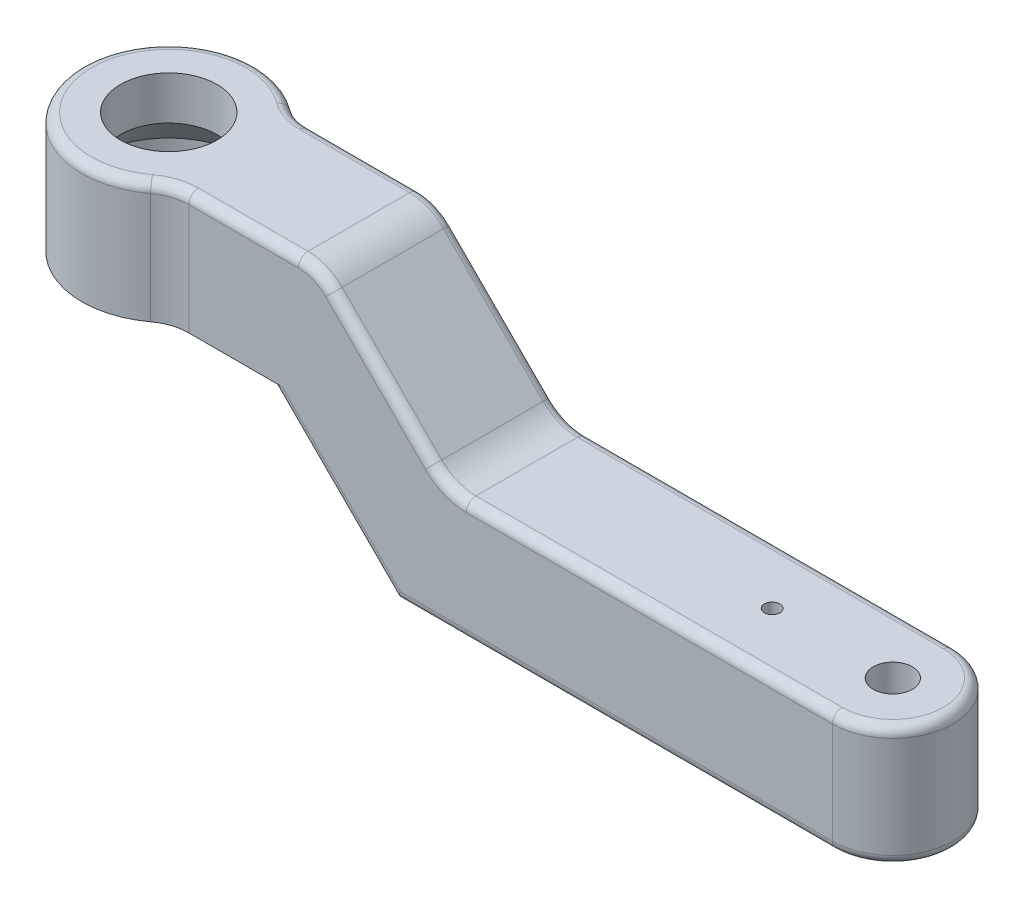
ISO-10303-21;
HEADER;
FILE_DESCRIPTION(('STEP AP214'),'2;1');
FILE_NAME('part.step','',(''),(''),'','','');
FILE_SCHEMA(('AUTOMOTIVE_DESIGN { 1 0 10303 214 1 1 1 1 }'));
ENDSEC;
DATA;
#1=APPLICATION_CONTEXT('core data for automotive mechanical design processes');
#2=APPLICATION_PROTOCOL_DEFINITION('international standard','automotive_design',2000,#1);
#3=PRODUCT_CONTEXT('',#1,'mechanical');
#4=PRODUCT('Part','Part','',(#3));
#5=PRODUCT_RELATED_PRODUCT_CATEGORY('part','',(#4));
#6=PRODUCT_DEFINITION_FORMATION('','',#4);
#7=PRODUCT_DEFINITION_CONTEXT('part definition',#1,'design');
#8=PRODUCT_DEFINITION('design','',#6,#7);
#9=PRODUCT_DEFINITION_SHAPE('','',#8);
#10=(LENGTH_UNIT() NAMED_UNIT(*) SI_UNIT(.MILLI.,.METRE.));
#11=(NAMED_UNIT(*) PLANE_ANGLE_UNIT() SI_UNIT($,.RADIAN.));
#12=(NAMED_UNIT(*) SI_UNIT($,.STERADIAN.) SOLID_ANGLE_UNIT());
#13=UNCERTAINTY_MEASURE_WITH_UNIT(LENGTH_MEASURE(1.E-05),#10,'distance_accuracy_value','');
#14=(GEOMETRIC_REPRESENTATION_CONTEXT(3) GLOBAL_UNCERTAINTY_ASSIGNED_CONTEXT((#13)) GLOBAL_UNIT_ASSIGNED_CONTEXT((#10,
#11,#12)) REPRESENTATION_CONTEXT('',''));
#15=CARTESIAN_POINT('',(0.,0.,0.));
#16=DIRECTION('',(0.,0.,1.));
#17=DIRECTION('',(1.,0.,0.));
#18=AXIS2_PLACEMENT_3D('',#15,#16,#17);
#19=CARTESIAN_POINT('',(75.,51.5,0.));
#20=DIRECTION('',(0.,-1.,0.));
#21=DIRECTION('',(0.,0.,-1.));
#22=AXIS2_PLACEMENT_3D('',#19,#20,#21);
#23=CYLINDRICAL_SURFACE('',#22,12.5);
#24=DIRECTION('',(0.,-1.,0.));
#25=VECTOR('',#24,1.);
#26=CARTESIAN_POINT('',(75.,51.5,12.5));
#27=LINE('',#26,#25);
#28=CARTESIAN_POINT('',(75.,23.,12.5));
#29=VERTEX_POINT('',#28);
#30=CARTESIAN_POINT('',(75.,2.,12.5));
#31=VERTEX_POINT('',#30);
#32=EDGE_CURVE('E197',#29,#31,#27,.T.);
#33=ORIENTED_EDGE('',*,*,#32,.T.);
#34=CARTESIAN_POINT('',(75.,2.,0.));
#35=DIRECTION('',(0.,1.,0.));
#36=DIRECTION('',(0.,0.,1.));
#37=AXIS2_PLACEMENT_3D('',#34,#35,#36);
#38=CIRCLE('',#37,12.5);
#39=CARTESIAN_POINT('',(75.,2.,-12.5));
#40=VERTEX_POINT('',#39);
#41=EDGE_CURVE('E363',#31,#40,#38,.T.);
#42=ORIENTED_EDGE('',*,*,#41,.T.);
#43=DIRECTION('',(0.,-1.,0.));
#44=VECTOR('',#43,1.);
#45=CARTESIAN_POINT('',(75.,51.5,-12.5));
#46=LINE('',#45,#44);
#47=CARTESIAN_POINT('',(75.,23.,-12.5));
#48=VERTEX_POINT('',#47);
#49=EDGE_CURVE('E231',#48,#40,#46,.T.);
#50=ORIENTED_EDGE('',*,*,#49,.F.);
#51=CARTESIAN_POINT('',(75.,23.,0.));
#52=DIRECTION('',(0.,-1.,0.));
#53=DIRECTION('',(1.,0.,0.));
#54=AXIS2_PLACEMENT_3D('',#51,#52,#53);
#55=CIRCLE('',#54,12.5);
#56=EDGE_CURVE('E310',#48,#29,#55,.T.);
#57=ORIENTED_EDGE('',*,*,#56,.T.);
#58=EDGE_LOOP('',(#33,#42,#50,#57));
#59=FACE_BOUND('',#58,.T.);
#60=ADVANCED_FACE('F35',(#59),#23,.T.);
#61=CARTESIAN_POINT('',(75.,51.5,-12.5));
#62=DIRECTION('',(0.,0.,1.));
#63=DIRECTION('',(1.,0.,0.));
#64=AXIS2_PLACEMENT_3D('',#61,#62,#63);
#65=PLANE('',#64);
#66=DIRECTION('',(-0.707106781186547,0.707106781186548,0.));
#67=VECTOR('',#66,1.);
#68=CARTESIAN_POINT('',(5.48654403270937,-18.0134559672906,-12.5));
#69=LINE('',#68,#67);
#70=CARTESIAN_POINT('',(-14.5269119345812,2.,-12.5));
#71=VERTEX_POINT('',#70);
#72=CARTESIAN_POINT('',(-39.0269119345812,26.5,-12.5));
#73=VERTEX_POINT('',#72);
#74=EDGE_CURVE('E370',#71,#73,#69,.T.);
#75=ORIENTED_EDGE('',*,*,#74,.T.);
#76=DIRECTION('',(-1.,0.,0.));
#77=VECTOR('',#76,1.);
#78=CARTESIAN_POINT('',(75.,26.5,-12.5));
#79=LINE('',#78,#77);
#80=CARTESIAN_POINT('',(-58.334166687501,26.5,-12.5));
#81=VERTEX_POINT('',#80);
#82=EDGE_CURVE('E51',#73,#81,#79,.T.);
#83=ORIENTED_EDGE('',*,*,#82,.T.);
#84=DIRECTION('',(0.,-1.,0.));
#85=VECTOR('',#84,1.);
#86=CARTESIAN_POINT('',(-58.334166687501,51.5,-12.5));
#87=LINE('',#86,#85);
#88=CARTESIAN_POINT('',(-58.334166687501,49.5,-12.5));
#89=VERTEX_POINT('',#88);
#90=EDGE_CURVE('E229',#89,#81,#87,.T.);
#91=ORIENTED_EDGE('',*,*,#90,.F.);
#92=DIRECTION('',(-1.,0.,0.));
#93=VECTOR('',#92,1.);
#94=CARTESIAN_POINT('',(-35.6421356237309,49.5,-12.5));
#95=LINE('',#94,#93);
#96=CARTESIAN_POINT('',(-35.6421356237309,49.5,-12.5));
#97=VERTEX_POINT('',#96);
#98=EDGE_CURVE('E264',#89,#97,#95,.F.);
#99=ORIENTED_EDGE('',*,*,#98,.T.);
#100=CARTESIAN_POINT('',(-35.6421356237309,41.5,-12.5));
#101=DIRECTION('',(0.,0.,1.));
#102=DIRECTION('',(1.,0.,0.));
#103=AXIS2_PLACEMENT_3D('',#100,#101,#102);
#104=CIRCLE('',#103,8.);
#105=CARTESIAN_POINT('',(-29.9852813742386,47.1568542494924,-12.5));
#106=VERTEX_POINT('',#105);
#107=EDGE_CURVE('E262',#97,#106,#104,.F.);
#108=ORIENTED_EDGE('',*,*,#107,.T.);
#109=DIRECTION('',(0.707106781186547,-0.707106781186548,0.));
#110=VECTOR('',#109,1.);
#111=CARTESIAN_POINT('',(20.3357864376269,-3.1642135623731,-12.5));
#112=LINE('',#111,#110);
#113=CARTESIAN_POINT('',(-9.34314575050762,26.5147186257614,-12.5));
#114=VERTEX_POINT('',#113);
#115=EDGE_CURVE('E260',#106,#114,#112,.T.);
#116=ORIENTED_EDGE('',*,*,#115,.T.);
#117=CARTESIAN_POINT('',(-0.857864376269044,35.,-12.5));
#118=DIRECTION('',(0.,0.,1.));
#119=DIRECTION('',(1.,0.,0.));
#120=AXIS2_PLACEMENT_3D('',#117,#118,#119);
#121=CIRCLE('',#120,12.);
#122=CARTESIAN_POINT('',(-0.857864376269042,23.,-12.5));
#123=VERTEX_POINT('',#122);
#124=EDGE_CURVE('E257',#114,#123,#121,.T.);
#125=ORIENTED_EDGE('',*,*,#124,.T.);
#126=DIRECTION('',(1.,0.,0.));
#127=VECTOR('',#126,1.);
#128=CARTESIAN_POINT('',(75.,23.,-12.5));
#129=LINE('',#128,#127);
#130=EDGE_CURVE('E255',#123,#48,#129,.T.);
#131=ORIENTED_EDGE('',*,*,#130,.T.);
#132=ORIENTED_EDGE('',*,*,#49,.T.);
#133=DIRECTION('',(-1.,0.,0.));
#134=VECTOR('',#133,1.);
#135=CARTESIAN_POINT('',(75.,2.,-12.5));
#136=LINE('',#135,#134);
#137=EDGE_CURVE('E58',#40,#71,#136,.T.);
#138=ORIENTED_EDGE('',*,*,#137,.T.);
#139=EDGE_LOOP('',(#75,#83,#91,#99,#108,#116,#125,#131,#132,#138));
#140=FACE_BOUND('',#139,.T.);
#141=ADVANCED_FACE('F391',(#140),#65,.F.);
#142=CARTESIAN_POINT('',(-58.334166687501,51.5,-22.5));
#143=DIRECTION('',(0.,-1.,0.));
#144=DIRECTION('',(0.,0.,-1.));
#145=AXIS2_PLACEMENT_3D('',#142,#143,#144);
#146=CYLINDRICAL_SURFACE('',#145,10.);
#147=DIRECTION('',(0.,-1.,0.));
#148=VECTOR('',#147,1.);
#149=CARTESIAN_POINT('',(-64.2862500133935,51.5,-14.4642857142857));
#150=LINE('',#149,#148);
#151=CARTESIAN_POINT('',(-64.2862500133935,49.5,-14.4642857142857));
#152=VERTEX_POINT('',#151);
#153=CARTESIAN_POINT('',(-64.2862500133935,26.5,-14.4642857142857));
#154=VERTEX_POINT('',#153);
#155=EDGE_CURVE('E227',#152,#154,#150,.T.);
#156=ORIENTED_EDGE('',*,*,#155,.F.);
#157=CARTESIAN_POINT('',(-58.334166687501,49.5,-22.5));
#158=DIRECTION('',(0.,1.,0.));
#159=DIRECTION('',(0.,0.,1.));
#160=AXIS2_PLACEMENT_3D('',#157,#158,#159);
#161=CIRCLE('',#160,10.);
#162=EDGE_CURVE('E289',#152,#89,#161,.T.);
#163=ORIENTED_EDGE('',*,*,#162,.T.);
#164=ORIENTED_EDGE('',*,*,#90,.T.);
#165=CARTESIAN_POINT('',(-58.334166687501,26.5,-22.5));
#166=DIRECTION('',(0.,1.,0.));
#167=DIRECTION('',(-1.,0.,0.));
#168=AXIS2_PLACEMENT_3D('',#165,#166,#167);
#169=CIRCLE('',#168,10.);
#170=EDGE_CURVE('E215',#81,#154,#169,.F.);
#171=ORIENTED_EDGE('',*,*,#170,.T.);
#172=EDGE_LOOP('',(#156,#163,#164,#171));
#173=FACE_BOUND('',#172,.T.);
#174=ADVANCED_FACE('F464',(#173),#146,.F.);
#175=CARTESIAN_POINT('',(-75.,51.5,0.));
#176=DIRECTION('',(0.,-1.,0.));
#177=DIRECTION('',(0.,0.,-1.));
#178=AXIS2_PLACEMENT_3D('',#175,#176,#177);
#179=CYLINDRICAL_SURFACE('',#178,18.);
#180=DIRECTION('',(0.,-1.,0.));
#181=VECTOR('',#180,1.);
#182=CARTESIAN_POINT('',(-64.2862500133935,51.5,14.4642857142857));
#183=LINE('',#182,#181);
#184=CARTESIAN_POINT('',(-64.2862500133935,49.5,14.4642857142857));
#185=VERTEX_POINT('',#184);
#186=CARTESIAN_POINT('',(-64.2862500133935,26.5,14.4642857142857));
#187=VERTEX_POINT('',#186);
#188=EDGE_CURVE('E196',#185,#187,#183,.T.);
#189=ORIENTED_EDGE('',*,*,#188,.F.);
#190=CARTESIAN_POINT('',(-75.,49.5,0.));
#191=DIRECTION('',(0.,1.,0.));
#192=DIRECTION('',(0.,0.,1.));
#193=AXIS2_PLACEMENT_3D('',#190,#191,#192);
#194=CIRCLE('',#193,18.);
#195=EDGE_CURVE('E291',#185,#152,#194,.F.);
#196=ORIENTED_EDGE('',*,*,#195,.T.);
#197=ORIENTED_EDGE('',*,*,#155,.T.);
#198=CARTESIAN_POINT('',(-75.,26.5,0.));
#199=DIRECTION('',(0.,1.,0.));
#200=DIRECTION('',(-1.,0.,0.));
#201=AXIS2_PLACEMENT_3D('',#198,#199,#200);
#202=CIRCLE('',#201,18.);
#203=EDGE_CURVE('E212',#154,#187,#202,.T.);
#204=ORIENTED_EDGE('',*,*,#203,.T.);
#205=EDGE_LOOP('',(#189,#196,#197,#204));
#206=FACE_BOUND('',#205,.T.);
#207=ADVANCED_FACE('F462',(#206),#179,.T.);
#208=CARTESIAN_POINT('',(-58.334166687501,51.5,22.5));
#209=DIRECTION('',(0.,-1.,0.));
#210=DIRECTION('',(0.,0.,-1.));
#211=AXIS2_PLACEMENT_3D('',#208,#209,#210);
#212=CYLINDRICAL_SURFACE('',#211,9.99999999999999);
#213=DIRECTION('',(0.,-1.,0.));
#214=VECTOR('',#213,1.);
#215=CARTESIAN_POINT('',(-58.334166687501,51.5,12.5));
#216=LINE('',#215,#214);
#217=CARTESIAN_POINT('',(-58.334166687501,49.5,12.5));
#218=VERTEX_POINT('',#217);
#219=CARTESIAN_POINT('',(-58.334166687501,26.5,12.5));
#220=VERTEX_POINT('',#219);
#221=EDGE_CURVE('E186',#218,#220,#216,.T.);
#222=ORIENTED_EDGE('',*,*,#221,.F.);
#223=CARTESIAN_POINT('',(-58.334166687501,49.5,22.5));
#224=DIRECTION('',(0.,1.,0.));
#225=DIRECTION('',(0.,0.,1.));
#226=AXIS2_PLACEMENT_3D('',#223,#224,#225);
#227=CIRCLE('',#226,9.99999999999999);
#228=EDGE_CURVE('E293',#218,#185,#227,.T.);
#229=ORIENTED_EDGE('',*,*,#228,.T.);
#230=ORIENTED_EDGE('',*,*,#188,.T.);
#231=CARTESIAN_POINT('',(-58.334166687501,26.5,22.5));
#232=DIRECTION('',(0.,1.,0.));
#233=DIRECTION('',(-1.,0.,0.));
#234=AXIS2_PLACEMENT_3D('',#231,#232,#233);
#235=CIRCLE('',#234,9.99999999999999);
#236=EDGE_CURVE('E202',#187,#220,#235,.F.);
#237=ORIENTED_EDGE('',*,*,#236,.T.);
#238=EDGE_LOOP('',(#222,#229,#230,#237));
#239=FACE_BOUND('',#238,.T.);
#240=ADVANCED_FACE('F209',(#239),#212,.F.);
#241=CARTESIAN_POINT('',(75.,51.5,12.5));
#242=DIRECTION('',(0.,0.,-1.));
#243=DIRECTION('',(-1.,0.,0.));
#244=AXIS2_PLACEMENT_3D('',#241,#242,#243);
#245=PLANE('',#244);
#246=DIRECTION('',(0.707106781186547,-0.707106781186548,0.));
#247=VECTOR('',#246,1.);
#248=CARTESIAN_POINT('',(5.48654403270937,-18.0134559672906,12.5));
#249=LINE('',#248,#247);
#250=CARTESIAN_POINT('',(-39.0269119345812,26.5,12.5));
#251=VERTEX_POINT('',#250);
#252=CARTESIAN_POINT('',(-14.5269119345812,2.,12.5));
#253=VERTEX_POINT('',#252);
#254=EDGE_CURVE('E312',#251,#253,#249,.T.);
#255=ORIENTED_EDGE('',*,*,#254,.T.);
#256=DIRECTION('',(1.,0.,0.));
#257=VECTOR('',#256,1.);
#258=CARTESIAN_POINT('',(75.,2.,12.5));
#259=LINE('',#258,#257);
#260=EDGE_CURVE('E354',#253,#31,#259,.T.);
#261=ORIENTED_EDGE('',*,*,#260,.T.);
#262=ORIENTED_EDGE('',*,*,#32,.F.);
#263=DIRECTION('',(-1.,0.,0.));
#264=VECTOR('',#263,1.);
#265=CARTESIAN_POINT('',(75.,23.,12.5));
#266=LINE('',#265,#264);
#267=CARTESIAN_POINT('',(-0.857864376269042,23.,12.5));
#268=VERTEX_POINT('',#267);
#269=EDGE_CURVE('E295',#29,#268,#266,.T.);
#270=ORIENTED_EDGE('',*,*,#269,.T.);
#271=CARTESIAN_POINT('',(-0.857864376269043,35.,12.5));
#272=DIRECTION('',(0.,0.,-1.));
#273=DIRECTION('',(-1.,0.,0.));
#274=AXIS2_PLACEMENT_3D('',#271,#272,#273);
#275=CIRCLE('',#274,12.);
#276=CARTESIAN_POINT('',(-9.34314575050761,26.5147186257614,12.5));
#277=VERTEX_POINT('',#276);
#278=EDGE_CURVE('E297',#268,#277,#275,.T.);
#279=ORIENTED_EDGE('',*,*,#278,.T.);
#280=DIRECTION('',(-0.707106781186547,0.707106781186548,0.));
#281=VECTOR('',#280,1.);
#282=CARTESIAN_POINT('',(20.3357864376269,-3.16421356237309,12.5));
#283=LINE('',#282,#281);
#284=CARTESIAN_POINT('',(-29.9852813742386,47.1568542494924,12.5));
#285=VERTEX_POINT('',#284);
#286=EDGE_CURVE('E299',#277,#285,#283,.T.);
#287=ORIENTED_EDGE('',*,*,#286,.T.);
#288=CARTESIAN_POINT('',(-35.6421356237309,41.5,12.5));
#289=DIRECTION('',(0.,0.,-1.));
#290=DIRECTION('',(-1.,0.,0.));
#291=AXIS2_PLACEMENT_3D('',#288,#289,#290);
#292=CIRCLE('',#291,8.);
#293=CARTESIAN_POINT('',(-35.6421356237309,49.5,12.5));
#294=VERTEX_POINT('',#293);
#295=EDGE_CURVE('E301',#285,#294,#292,.F.);
#296=ORIENTED_EDGE('',*,*,#295,.T.);
#297=DIRECTION('',(1.,0.,0.));
#298=VECTOR('',#297,1.);
#299=CARTESIAN_POINT('',(-58.334166687501,49.5,12.5));
#300=LINE('',#299,#298);
#301=EDGE_CURVE('E192',#294,#218,#300,.F.);
#302=ORIENTED_EDGE('',*,*,#301,.T.);
#303=ORIENTED_EDGE('',*,*,#221,.T.);
#304=DIRECTION('',(1.,0.,0.));
#305=VECTOR('',#304,1.);
#306=CARTESIAN_POINT('',(75.,26.5,12.5));
#307=LINE('',#306,#305);
#308=EDGE_CURVE('E189',#220,#251,#307,.T.);
#309=ORIENTED_EDGE('',*,*,#308,.T.);
#310=EDGE_LOOP('',(#255,#261,#262,#270,#279,#287,#296,#302,#303,#309));
#311=FACE_BOUND('',#310,.T.);
#312=ADVANCED_FACE('F188',(#311),#245,.F.);
#313=CARTESIAN_POINT('',(75.,51.5,0.));
#314=DIRECTION('',(0.,1.,0.));
#315=DIRECTION('',(0.,0.,1.));
#316=AXIS2_PLACEMENT_3D('',#313,#314,#315);
#317=PLANE('',#316);
#318=CARTESIAN_POINT('',(-75.,51.5,0.));
#319=DIRECTION('',(0.,-1.,0.));
#320=DIRECTION('',(0.,0.,-1.));
#321=AXIS2_PLACEMENT_3D('',#318,#319,#320);
#322=CIRCLE('',#321,9.99999999999999);
#323=CARTESIAN_POINT('',(-75.,51.5,-9.99999999999999));
#324=VERTEX_POINT('',#323);
#325=EDGE_CURVE('E217',#324,#324,#322,.T.);
#326=ORIENTED_EDGE('',*,*,#325,.T.);
#327=EDGE_LOOP('',(#326));
#328=FACE_BOUND('',#327,.T.);
#329=DIRECTION('',(0.,0.,1.));
#330=VECTOR('',#329,1.);
#331=CARTESIAN_POINT('',(-35.6421356237309,51.5,-12.5));
#332=LINE('',#331,#330);
#333=CARTESIAN_POINT('',(-35.6421356237309,51.5,10.5));
#334=VERTEX_POINT('',#333);
#335=CARTESIAN_POINT('',(-35.6421356237309,51.5,-10.5));
#336=VERTEX_POINT('',#335);
#337=EDGE_CURVE('E249',#334,#336,#332,.F.);
#338=ORIENTED_EDGE('',*,*,#337,.T.);
#339=DIRECTION('',(-1.,0.,0.));
#340=VECTOR('',#339,1.);
#341=CARTESIAN_POINT('',(-58.334166687501,51.5,-10.5));
#342=LINE('',#341,#340);
#343=CARTESIAN_POINT('',(-58.334166687501,51.5,-10.5));
#344=VERTEX_POINT('',#343);
#345=EDGE_CURVE('E287',#336,#344,#342,.T.);
#346=ORIENTED_EDGE('',*,*,#345,.T.);
#347=CARTESIAN_POINT('',(-58.334166687501,51.5,-22.5));
#348=DIRECTION('',(0.,1.,0.));
#349=DIRECTION('',(0.,0.,1.));
#350=AXIS2_PLACEMENT_3D('',#347,#348,#349);
#351=CIRCLE('',#350,12.);
#352=CARTESIAN_POINT('',(-65.476666678572,51.5,-12.8571428571428));
#353=VERTEX_POINT('',#352);
#354=EDGE_CURVE('E285',#344,#353,#351,.F.);
#355=ORIENTED_EDGE('',*,*,#354,.T.);
#356=CARTESIAN_POINT('',(-75.,51.5,0.));
#357=DIRECTION('',(0.,1.,0.));
#358=DIRECTION('',(0.,0.,1.));
#359=AXIS2_PLACEMENT_3D('',#356,#357,#358);
#360=CIRCLE('',#359,16.);
#361=CARTESIAN_POINT('',(-65.476666678572,51.5,12.8571428571429));
#362=VERTEX_POINT('',#361);
#363=EDGE_CURVE('E283',#353,#362,#360,.T.);
#364=ORIENTED_EDGE('',*,*,#363,.T.);
#365=CARTESIAN_POINT('',(-58.334166687501,51.5,22.5));
#366=DIRECTION('',(0.,1.,0.));
#367=DIRECTION('',(0.,0.,1.));
#368=AXIS2_PLACEMENT_3D('',#365,#366,#367);
#369=CIRCLE('',#368,12.);
#370=CARTESIAN_POINT('',(-58.334166687501,51.5,10.5));
#371=VERTEX_POINT('',#370);
#372=EDGE_CURVE('E281',#362,#371,#369,.F.);
#373=ORIENTED_EDGE('',*,*,#372,.T.);
#374=DIRECTION('',(1.,0.,0.));
#375=VECTOR('',#374,1.);
#376=CARTESIAN_POINT('',(-35.6421356237309,51.5,10.5));
#377=LINE('',#376,#375);
#378=EDGE_CURVE('E279',#371,#334,#377,.T.);
#379=ORIENTED_EDGE('',*,*,#378,.T.);
#380=EDGE_LOOP('',(#338,#346,#355,#364,#373,#379));
#381=FACE_BOUND('',#380,.T.);
#382=ADVANCED_FACE('F470',(#328,#381),#317,.T.);
#383=CARTESIAN_POINT('',(75.,0.,0.));
#384=DIRECTION('',(0.,1.,0.));
#385=DIRECTION('',(0.,0.,1.));
#386=AXIS2_PLACEMENT_3D('',#383,#384,#385);
#387=PLANE('',#386);
#388=CARTESIAN_POINT('',(50.,0.,0.));
#389=DIRECTION('',(0.,1.,0.));
#390=DIRECTION('',(0.,0.,1.));
#391=AXIS2_PLACEMENT_3D('',#388,#389,#390);
#392=CIRCLE('',#391,1.6);
#393=CARTESIAN_POINT('',(50.,0.,1.59999999999999));
#394=VERTEX_POINT('',#393);
#395=EDGE_CURVE('E243',#394,#394,#392,.T.);
#396=ORIENTED_EDGE('',*,*,#395,.T.);
#397=EDGE_LOOP('',(#396));
#398=FACE_BOUND('',#397,.T.);
#399=CARTESIAN_POINT('',(75.,0.,0.));
#400=DIRECTION('',(0.,1.,0.));
#401=DIRECTION('',(0.,0.,1.));
#402=AXIS2_PLACEMENT_3D('',#399,#400,#401);
#403=CIRCLE('',#402,4.05);
#404=CARTESIAN_POINT('',(75.,0.,4.05));
#405=VERTEX_POINT('',#404);
#406=EDGE_CURVE('E239',#405,#405,#403,.T.);
#407=ORIENTED_EDGE('',*,*,#406,.T.);
#408=EDGE_LOOP('',(#407));
#409=FACE_BOUND('',#408,.T.);
#410=CARTESIAN_POINT('',(75.,0.,0.));
#411=DIRECTION('',(0.,1.,0.));
#412=DIRECTION('',(0.,0.,1.));
#413=AXIS2_PLACEMENT_3D('',#410,#411,#412);
#414=CIRCLE('',#413,10.5);
#415=CARTESIAN_POINT('',(75.,0.,-10.5));
#416=VERTEX_POINT('',#415);
#417=CARTESIAN_POINT('',(75.,0.,10.5));
#418=VERTEX_POINT('',#417);
#419=EDGE_CURVE('E359',#416,#418,#414,.F.);
#420=ORIENTED_EDGE('',*,*,#419,.T.);
#421=DIRECTION('',(1.,0.,0.));
#422=VECTOR('',#421,1.);
#423=CARTESIAN_POINT('',(75.,0.,10.5));
#424=LINE('',#423,#422);
#425=CARTESIAN_POINT('',(-15.3553390593274,0.,10.5));
#426=VERTEX_POINT('',#425);
#427=EDGE_CURVE('E361',#418,#426,#424,.F.);
#428=ORIENTED_EDGE('',*,*,#427,.T.);
#429=DIRECTION('',(0.,0.,-1.));
#430=VECTOR('',#429,1.);
#431=CARTESIAN_POINT('',(-15.3553390593274,0.,0.));
#432=LINE('',#431,#430);
#433=CARTESIAN_POINT('',(-15.3553390593274,0.,-10.5));
#434=VERTEX_POINT('',#433);
#435=EDGE_CURVE('E207',#426,#434,#432,.T.);
#436=ORIENTED_EDGE('',*,*,#435,.T.);
#437=DIRECTION('',(-1.,0.,0.));
#438=VECTOR('',#437,1.);
#439=CARTESIAN_POINT('',(75.,0.,-10.5));
#440=LINE('',#439,#438);
#441=EDGE_CURVE('E357',#434,#416,#440,.F.);
#442=ORIENTED_EDGE('',*,*,#441,.T.);
#443=EDGE_LOOP('',(#420,#428,#436,#442));
#444=FACE_BOUND('',#443,.T.);
#445=ADVANCED_FACE('F484',(#398,#409,#444),#387,.F.);
#446=CARTESIAN_POINT('',(87.5,25.,-25.75));
#447=DIRECTION('',(0.,-1.,0.));
#448=DIRECTION('',(1.,0.,0.));
#449=AXIS2_PLACEMENT_3D('',#446,#447,#448);
#450=PLANE('',#449);
#451=CARTESIAN_POINT('',(50.,25.,0.));
#452=DIRECTION('',(0.,-1.,0.));
#453=DIRECTION('',(1.,0.,0.));
#454=AXIS2_PLACEMENT_3D('',#451,#452,#453);
#455=CIRCLE('',#454,1.6);
#456=CARTESIAN_POINT('',(51.6,25.,0.));
#457=VERTEX_POINT('',#456);
#458=EDGE_CURVE('E240',#457,#457,#455,.F.);
#459=ORIENTED_EDGE('',*,*,#458,.F.);
#460=EDGE_LOOP('',(#459));
#461=FACE_BOUND('',#460,.T.);
#462=CARTESIAN_POINT('',(75.,25.,0.));
#463=DIRECTION('',(0.,-1.,0.));
#464=DIRECTION('',(1.,0.,0.));
#465=AXIS2_PLACEMENT_3D('',#462,#463,#464);
#466=CIRCLE('',#465,4.05);
#467=CARTESIAN_POINT('',(79.05,25.,0.));
#468=VERTEX_POINT('',#467);
#469=EDGE_CURVE('E235',#468,#468,#466,.F.);
#470=ORIENTED_EDGE('',*,*,#469,.F.);
#471=EDGE_LOOP('',(#470));
#472=FACE_BOUND('',#471,.T.);
#473=DIRECTION('',(0.,0.,1.));
#474=VECTOR('',#473,1.);
#475=CARTESIAN_POINT('',(-0.857864376269042,25.,12.5));
#476=LINE('',#475,#474);
#477=CARTESIAN_POINT('',(-0.857864376269042,25.,-10.5));
#478=VERTEX_POINT('',#477);
#479=CARTESIAN_POINT('',(-0.857864376269042,25.,10.5));
#480=VERTEX_POINT('',#479);
#481=EDGE_CURVE('E252',#478,#480,#476,.T.);
#482=ORIENTED_EDGE('',*,*,#481,.T.);
#483=DIRECTION('',(-1.,0.,0.));
#484=VECTOR('',#483,1.);
#485=CARTESIAN_POINT('',(87.5,25.,10.5));
#486=LINE('',#485,#484);
#487=CARTESIAN_POINT('',(75.,25.,10.5));
#488=VERTEX_POINT('',#487);
#489=EDGE_CURVE('E308',#480,#488,#486,.F.);
#490=ORIENTED_EDGE('',*,*,#489,.T.);
#491=CARTESIAN_POINT('',(75.,25.,0.));
#492=DIRECTION('',(0.,-1.,0.));
#493=DIRECTION('',(1.,0.,0.));
#494=AXIS2_PLACEMENT_3D('',#491,#492,#493);
#495=CIRCLE('',#494,10.5);
#496=CARTESIAN_POINT('',(75.,25.,-10.5));
#497=VERTEX_POINT('',#496);
#498=EDGE_CURVE('E306',#488,#497,#495,.F.);
#499=ORIENTED_EDGE('',*,*,#498,.T.);
#500=DIRECTION('',(1.,0.,0.));
#501=VECTOR('',#500,1.);
#502=CARTESIAN_POINT('',(87.5,25.,-10.5));
#503=LINE('',#502,#501);
#504=EDGE_CURVE('E304',#497,#478,#503,.F.);
#505=ORIENTED_EDGE('',*,*,#504,.T.);
#506=EDGE_LOOP('',(#482,#490,#499,#505));
#507=FACE_BOUND('',#506,.T.);
#508=ADVANCED_FACE('F482',(#461,#472,#507),#450,.F.);
#509=CARTESIAN_POINT('',(-4.99999999999999,25.,-25.75));
#510=DIRECTION('',(-0.707106781186548,-0.707106781186547,0.));
#511=DIRECTION('',(0.707106781186547,-0.707106781186548,0.));
#512=AXIS2_PLACEMENT_3D('',#509,#510,#511);
#513=PLANE('',#512);
#514=DIRECTION('',(0.,0.,1.));
#515=VECTOR('',#514,1.);
#516=CARTESIAN_POINT('',(-7.92893218813452,27.9289321881345,-12.5));
#517=LINE('',#516,#515);
#518=CARTESIAN_POINT('',(-7.92893218813452,27.9289321881345,10.5));
#519=VERTEX_POINT('',#518);
#520=CARTESIAN_POINT('',(-7.92893218813452,27.9289321881345,-10.5));
#521=VERTEX_POINT('',#520);
#522=EDGE_CURVE('E206',#519,#521,#517,.F.);
#523=ORIENTED_EDGE('',*,*,#522,.T.);
#524=DIRECTION('',(0.707106781186547,-0.707106781186548,0.));
#525=VECTOR('',#524,1.);
#526=CARTESIAN_POINT('',(-4.99999999999999,25.,-10.5));
#527=LINE('',#526,#525);
#528=CARTESIAN_POINT('',(-28.5710678118655,48.5710678118655,-10.5));
#529=VERTEX_POINT('',#528);
#530=EDGE_CURVE('E273',#521,#529,#527,.F.);
#531=ORIENTED_EDGE('',*,*,#530,.T.);
#532=DIRECTION('',(0.,0.,1.));
#533=VECTOR('',#532,1.);
#534=CARTESIAN_POINT('',(-28.5710678118655,48.5710678118655,12.5));
#535=LINE('',#534,#533);
#536=CARTESIAN_POINT('',(-28.5710678118655,48.5710678118655,10.5));
#537=VERTEX_POINT('',#536);
#538=EDGE_CURVE('E246',#529,#537,#535,.T.);
#539=ORIENTED_EDGE('',*,*,#538,.T.);
#540=DIRECTION('',(-0.707106781186547,0.707106781186548,0.));
#541=VECTOR('',#540,1.);
#542=CARTESIAN_POINT('',(-4.99999999999999,25.,10.5));
#543=LINE('',#542,#541);
#544=EDGE_CURVE('E271',#537,#519,#543,.F.);
#545=ORIENTED_EDGE('',*,*,#544,.T.);
#546=EDGE_LOOP('',(#523,#531,#539,#545));
#547=FACE_BOUND('',#546,.T.);
#548=ADVANCED_FACE('F476',(#547),#513,.F.);
#549=CARTESIAN_POINT('',(-41.8553390593274,26.5,-25.75));
#550=DIRECTION('',(0.,1.,0.));
#551=DIRECTION('',(-1.,0.,0.));
#552=AXIS2_PLACEMENT_3D('',#549,#550,#551);
#553=PLANE('',#552);
#554=CARTESIAN_POINT('',(-75.,26.5,0.));
#555=DIRECTION('',(0.,-1.,0.));
#556=DIRECTION('',(0.,0.,-1.));
#557=AXIS2_PLACEMENT_3D('',#554,#555,#556);
#558=CIRCLE('',#557,16.1);
#559=CARTESIAN_POINT('',(-75.,26.5,-16.1));
#560=VERTEX_POINT('',#559);
#561=EDGE_CURVE('E238',#560,#560,#558,.T.);
#562=ORIENTED_EDGE('',*,*,#561,.F.);
#563=EDGE_LOOP('',(#562));
#564=FACE_BOUND('',#563,.T.);
#565=ORIENTED_EDGE('',*,*,#82,.F.);
#566=CARTESIAN_POINT('',(-39.0269119345812,26.5,-10.5));
#567=DIRECTION('',(0.,1.,0.));
#568=DIRECTION('',(-1.,0.,0.));
#569=AXIS2_PLACEMENT_3D('',#566,#567,#568);
#570=ELLIPSE('',#569,2.82842712474619,2.);
#571=CARTESIAN_POINT('',(-41.8553390593274,26.5,-10.5));
#572=VERTEX_POINT('',#571);
#573=EDGE_CURVE('E11',#73,#572,#570,.T.);
#574=ORIENTED_EDGE('',*,*,#573,.T.);
#575=DIRECTION('',(0.,0.,1.));
#576=VECTOR('',#575,1.);
#577=CARTESIAN_POINT('',(-41.8553390593274,26.5,-25.75));
#578=LINE('',#577,#576);
#579=CARTESIAN_POINT('',(-41.8553390593274,26.5,10.5));
#580=VERTEX_POINT('',#579);
#581=EDGE_CURVE('E213',#572,#580,#578,.T.);
#582=ORIENTED_EDGE('',*,*,#581,.T.);
#583=CARTESIAN_POINT('',(-39.0269119345812,26.5,10.5));
#584=DIRECTION('',(0.,1.,0.));
#585=DIRECTION('',(1.,0.,0.));
#586=AXIS2_PLACEMENT_3D('',#583,#584,#585);
#587=ELLIPSE('',#586,2.82842712474619,2.);
#588=EDGE_CURVE('E44',#580,#251,#587,.T.);
#589=ORIENTED_EDGE('',*,*,#588,.T.);
#590=ORIENTED_EDGE('',*,*,#308,.F.);
#591=ORIENTED_EDGE('',*,*,#236,.F.);
#592=ORIENTED_EDGE('',*,*,#203,.F.);
#593=ORIENTED_EDGE('',*,*,#170,.F.);
#594=EDGE_LOOP('',(#565,#574,#582,#589,#590,#591,#592,#593));
#595=FACE_BOUND('',#594,.T.);
#596=ADVANCED_FACE('F200',(#564,#595),#553,.F.);
#597=CARTESIAN_POINT('',(-15.3553390593274,0.,-25.75));
#598=DIRECTION('',(0.707106781186548,0.707106781186547,0.));
#599=DIRECTION('',(-0.707106781186547,0.707106781186548,0.));
#600=AXIS2_PLACEMENT_3D('',#597,#598,#599);
#601=PLANE('',#600);
#602=ORIENTED_EDGE('',*,*,#435,.F.);
#603=DIRECTION('',(0.707106781186547,-0.707106781186548,0.));
#604=VECTOR('',#603,1.);
#605=CARTESIAN_POINT('',(-15.3553390593274,0.,10.5));
#606=LINE('',#605,#604);
#607=EDGE_CURVE('E367',#426,#580,#606,.F.);
#608=ORIENTED_EDGE('',*,*,#607,.T.);
#609=ORIENTED_EDGE('',*,*,#581,.F.);
#610=DIRECTION('',(-0.707106781186547,0.707106781186548,0.));
#611=VECTOR('',#610,1.);
#612=CARTESIAN_POINT('',(-15.3553390593274,0.,-10.5));
#613=LINE('',#612,#611);
#614=EDGE_CURVE('E365',#572,#434,#613,.F.);
#615=ORIENTED_EDGE('',*,*,#614,.T.);
#616=EDGE_LOOP('',(#602,#608,#609,#615));
#617=FACE_BOUND('',#616,.T.);
#618=ADVANCED_FACE('F659',(#617),#601,.F.);
#619=CARTESIAN_POINT('',(-75.,26.5,0.));
#620=DIRECTION('',(0.,-1.,0.));
#621=DIRECTION('',(0.,0.,-1.));
#622=AXIS2_PLACEMENT_3D('',#619,#620,#621);
#623=CYLINDRICAL_SURFACE('',#622,9.99999999999999);
#624=CARTESIAN_POINT('',(-75.,42.5,0.));
#625=DIRECTION('',(0.,-1.,0.));
#626=DIRECTION('',(0.,0.,-1.));
#627=AXIS2_PLACEMENT_3D('',#624,#625,#626);
#628=CIRCLE('',#627,9.99999999999999);
#629=CARTESIAN_POINT('',(-75.,42.5,-9.99999999999999));
#630=VERTEX_POINT('',#629);
#631=EDGE_CURVE('E746',#630,#630,#628,.T.);
#632=ORIENTED_EDGE('',*,*,#631,.T.);
#633=EDGE_LOOP('',(#632));
#634=FACE_BOUND('',#633,.T.);
#635=ORIENTED_EDGE('',*,*,#325,.F.);
#636=EDGE_LOOP('',(#635));
#637=FACE_BOUND('',#636,.T.);
#638=ADVANCED_FACE('F651',(#634,#637),#623,.F.);
#639=CARTESIAN_POINT('',(-75.,42.5,0.));
#640=DIRECTION('',(0.,-1.,0.));
#641=DIRECTION('',(0.,0.,-1.));
#642=AXIS2_PLACEMENT_3D('',#639,#640,#641);
#643=CONICAL_SURFACE('',#642,9.99999999999999,0.716803659943174);
#644=CARTESIAN_POINT('',(-75.,35.5,0.));
#645=DIRECTION('',(0.,-1.,0.));
#646=DIRECTION('',(0.,0.,-1.));
#647=AXIS2_PLACEMENT_3D('',#644,#645,#646);
#648=CIRCLE('',#647,16.1);
#649=CARTESIAN_POINT('',(-75.,35.5,-16.1));
#650=VERTEX_POINT('',#649);
#651=EDGE_CURVE('E748',#650,#650,#648,.T.);
#652=ORIENTED_EDGE('',*,*,#651,.T.);
#653=EDGE_LOOP('',(#652));
#654=FACE_BOUND('',#653,.T.);
#655=ORIENTED_EDGE('',*,*,#631,.F.);
#656=EDGE_LOOP('',(#655));
#657=FACE_BOUND('',#656,.T.);
#658=ADVANCED_FACE('F643',(#654,#657),#643,.F.);
#659=CARTESIAN_POINT('',(-75.,26.5,0.));
#660=DIRECTION('',(0.,-1.,0.));
#661=DIRECTION('',(0.,0.,-1.));
#662=AXIS2_PLACEMENT_3D('',#659,#660,#661);
#663=CYLINDRICAL_SURFACE('',#662,16.1);
#664=ORIENTED_EDGE('',*,*,#561,.T.);
#665=EDGE_LOOP('',(#664));
#666=FACE_BOUND('',#665,.T.);
#667=ORIENTED_EDGE('',*,*,#651,.F.);
#668=EDGE_LOOP('',(#667));
#669=FACE_BOUND('',#668,.T.);
#670=ADVANCED_FACE('F635',(#666,#669),#663,.F.);
#671=CARTESIAN_POINT('',(75.,51.5,0.));
#672=DIRECTION('',(0.,-1.,0.));
#673=DIRECTION('',(0.,0.,-1.));
#674=AXIS2_PLACEMENT_3D('',#671,#672,#673);
#675=CYLINDRICAL_SURFACE('',#674,4.05);
#676=ORIENTED_EDGE('',*,*,#406,.F.);
#677=EDGE_LOOP('',(#676));
#678=FACE_BOUND('',#677,.T.);
#679=ORIENTED_EDGE('',*,*,#469,.T.);
#680=EDGE_LOOP('',(#679));
#681=FACE_BOUND('',#680,.T.);
#682=ADVANCED_FACE('F626',(#678,#681),#675,.F.);
#683=CARTESIAN_POINT('',(50.,51.5,0.));
#684=DIRECTION('',(0.,-1.,0.));
#685=DIRECTION('',(0.,0.,-1.));
#686=AXIS2_PLACEMENT_3D('',#683,#684,#685);
#687=CYLINDRICAL_SURFACE('',#686,1.6);
#688=ORIENTED_EDGE('',*,*,#395,.F.);
#689=EDGE_LOOP('',(#688));
#690=FACE_BOUND('',#689,.T.);
#691=ORIENTED_EDGE('',*,*,#458,.T.);
#692=EDGE_LOOP('',(#691));
#693=FACE_BOUND('',#692,.T.);
#694=ADVANCED_FACE('F509',(#690,#693),#687,.F.);
#695=CARTESIAN_POINT('',(-35.6421356237309,41.5,-25.75));
#696=DIRECTION('',(0.,0.,-1.));
#697=DIRECTION('',(-1.,0.,0.));
#698=AXIS2_PLACEMENT_3D('',#695,#696,#697);
#699=CYLINDRICAL_SURFACE('',#698,10.);
#700=ORIENTED_EDGE('',*,*,#538,.F.);
#701=CARTESIAN_POINT('',(-35.6421356237309,41.5,-10.5));
#702=DIRECTION('',(0.,0.,1.));
#703=DIRECTION('',(1.,0.,0.));
#704=AXIS2_PLACEMENT_3D('',#701,#702,#703);
#705=CIRCLE('',#704,10.);
#706=EDGE_CURVE('E277',#529,#336,#705,.T.);
#707=ORIENTED_EDGE('',*,*,#706,.T.);
#708=ORIENTED_EDGE('',*,*,#337,.F.);
#709=CARTESIAN_POINT('',(-35.6421356237309,41.5,10.5));
#710=DIRECTION('',(0.,0.,-1.));
#711=DIRECTION('',(-1.,0.,0.));
#712=AXIS2_PLACEMENT_3D('',#709,#710,#711);
#713=CIRCLE('',#712,10.);
#714=EDGE_CURVE('E275',#334,#537,#713,.T.);
#715=ORIENTED_EDGE('',*,*,#714,.T.);
#716=EDGE_LOOP('',(#700,#707,#708,#715));
#717=FACE_BOUND('',#716,.T.);
#718=ADVANCED_FACE('F474',(#717),#699,.T.);
#719=CARTESIAN_POINT('',(-0.857864376269044,35.,-25.75));
#720=DIRECTION('',(0.,0.,-1.));
#721=DIRECTION('',(-1.,0.,0.));
#722=AXIS2_PLACEMENT_3D('',#719,#720,#721);
#723=CYLINDRICAL_SURFACE('',#722,10.);
#724=ORIENTED_EDGE('',*,*,#481,.F.);
#725=CARTESIAN_POINT('',(-0.857864376269044,35.,-10.5));
#726=DIRECTION('',(0.,0.,1.));
#727=DIRECTION('',(1.,0.,0.));
#728=AXIS2_PLACEMENT_3D('',#725,#726,#727);
#729=CIRCLE('',#728,10.);
#730=EDGE_CURVE('E268',#478,#521,#729,.F.);
#731=ORIENTED_EDGE('',*,*,#730,.T.);
#732=ORIENTED_EDGE('',*,*,#522,.F.);
#733=CARTESIAN_POINT('',(-0.857864376269044,35.,10.5));
#734=DIRECTION('',(0.,0.,-1.));
#735=DIRECTION('',(-1.,0.,0.));
#736=AXIS2_PLACEMENT_3D('',#733,#734,#735);
#737=CIRCLE('',#736,10.);
#738=EDGE_CURVE('E266',#519,#480,#737,.F.);
#739=ORIENTED_EDGE('',*,*,#738,.T.);
#740=EDGE_LOOP('',(#724,#731,#732,#739));
#741=FACE_BOUND('',#740,.T.);
#742=ADVANCED_FACE('F480',(#741),#723,.F.);
#743=CARTESIAN_POINT('',(75.,49.5,10.5));
#744=DIRECTION('',(-1.,0.,0.));
#745=DIRECTION('',(0.,0.,1.));
#746=AXIS2_PLACEMENT_3D('',#743,#744,#745);
#747=CYLINDRICAL_SURFACE('',#746,2.);
#748=CARTESIAN_POINT('',(-35.6421356237309,49.5,10.5));
#749=DIRECTION('',(1.,0.,0.));
#750=DIRECTION('',(0.,0.,-1.));
#751=AXIS2_PLACEMENT_3D('',#748,#749,#750);
#752=CIRCLE('',#751,2.);
#753=EDGE_CURVE('E347',#334,#294,#752,.T.);
#754=ORIENTED_EDGE('',*,*,#753,.F.);
#755=ORIENTED_EDGE('',*,*,#378,.F.);
#756=CARTESIAN_POINT('',(-58.334166687501,49.5,10.5));
#757=DIRECTION('',(-1.,0.,0.));
#758=DIRECTION('',(0.,0.,1.));
#759=AXIS2_PLACEMENT_3D('',#756,#757,#758);
#760=CIRCLE('',#759,2.);
#761=EDGE_CURVE('E350',#218,#371,#760,.T.);
#762=ORIENTED_EDGE('',*,*,#761,.F.);
#763=ORIENTED_EDGE('',*,*,#301,.F.);
#764=EDGE_LOOP('',(#754,#755,#762,#763));
#765=FACE_BOUND('',#764,.T.);
#766=ADVANCED_FACE('F454',(#765),#747,.T.);
#767=CARTESIAN_POINT('',(-58.334166687501,49.5,22.5));
#768=DIRECTION('',(0.,1.,0.));
#769=DIRECTION('',(0.,0.,1.));
#770=AXIS2_PLACEMENT_3D('',#767,#768,#769);
#771=TOROIDAL_SURFACE('',#770,12.,2.);
#772=ORIENTED_EDGE('',*,*,#761,.T.);
#773=ORIENTED_EDGE('',*,*,#372,.F.);
#774=CARTESIAN_POINT('',(-65.476666678572,49.5,12.8571428571429));
#775=DIRECTION('',(-0.803571428571429,0.,0.595208332589247));
#776=DIRECTION('',(0.595208332589248,0.,0.803571428571429));
#777=AXIS2_PLACEMENT_3D('',#774,#775,#776);
#778=CIRCLE('',#777,2.);
#779=EDGE_CURVE('E344',#185,#362,#778,.T.);
#780=ORIENTED_EDGE('',*,*,#779,.F.);
#781=ORIENTED_EDGE('',*,*,#228,.F.);
#782=EDGE_LOOP('',(#772,#773,#780,#781));
#783=FACE_BOUND('',#782,.T.);
#784=ADVANCED_FACE('F459',(#783),#771,.T.);
#785=CARTESIAN_POINT('',(-35.6421356237309,41.5,10.5));
#786=DIRECTION('',(0.,0.,-1.));
#787=DIRECTION('',(-1.,0.,0.));
#788=AXIS2_PLACEMENT_3D('',#785,#786,#787);
#789=TOROIDAL_SURFACE('',#788,8.,2.);
#790=ORIENTED_EDGE('',*,*,#753,.T.);
#791=ORIENTED_EDGE('',*,*,#295,.F.);
#792=CARTESIAN_POINT('',(-29.9852813742386,47.1568542494924,10.5));
#793=DIRECTION('',(0.707106781186548,-0.707106781186547,0.));
#794=DIRECTION('',(0.707106781186547,0.707106781186548,0.));
#795=AXIS2_PLACEMENT_3D('',#792,#793,#794);
#796=CIRCLE('',#795,2.);
#797=EDGE_CURVE('E341',#537,#285,#796,.T.);
#798=ORIENTED_EDGE('',*,*,#797,.F.);
#799=ORIENTED_EDGE('',*,*,#714,.F.);
#800=EDGE_LOOP('',(#790,#791,#798,#799));
#801=FACE_BOUND('',#800,.T.);
#802=ADVANCED_FACE('F449',(#801),#789,.T.);
#803=CARTESIAN_POINT('',(-75.,49.5,0.));
#804=DIRECTION('',(0.,1.,0.));
#805=DIRECTION('',(0.,0.,1.));
#806=AXIS2_PLACEMENT_3D('',#803,#804,#805);
#807=TOROIDAL_SURFACE('',#806,16.,2.);
#808=ORIENTED_EDGE('',*,*,#779,.T.);
#809=ORIENTED_EDGE('',*,*,#363,.F.);
#810=CARTESIAN_POINT('',(-65.476666678572,49.5,-12.8571428571428));
#811=DIRECTION('',(0.803571428571429,0.,0.595208332589247));
#812=DIRECTION('',(0.595208332589248,0.,-0.803571428571429));
#813=AXIS2_PLACEMENT_3D('',#810,#811,#812);
#814=CIRCLE('',#813,2.);
#815=EDGE_CURVE('E338',#152,#353,#814,.T.);
#816=ORIENTED_EDGE('',*,*,#815,.F.);
#817=ORIENTED_EDGE('',*,*,#195,.F.);
#818=EDGE_LOOP('',(#808,#809,#816,#817));
#819=FACE_BOUND('',#818,.T.);
#820=ADVANCED_FACE('F468',(#819),#807,.T.);
#821=CARTESIAN_POINT('',(20.3357864376269,-3.16421356237309,10.5));
#822=DIRECTION('',(-0.707106781186547,0.707106781186548,0.));
#823=DIRECTION('',(-0.707106781186548,-0.707106781186547,0.));
#824=AXIS2_PLACEMENT_3D('',#821,#822,#823);
#825=CYLINDRICAL_SURFACE('',#824,2.);
#826=ORIENTED_EDGE('',*,*,#797,.T.);
#827=ORIENTED_EDGE('',*,*,#286,.F.);
#828=CARTESIAN_POINT('',(-9.34314575050761,26.5147186257614,10.5));
#829=DIRECTION('',(0.707106781186547,-0.707106781186548,0.));
#830=DIRECTION('',(0.707106781186548,0.707106781186547,0.));
#831=AXIS2_PLACEMENT_3D('',#828,#829,#830);
#832=CIRCLE('',#831,2.);
#833=EDGE_CURVE('E335',#519,#277,#832,.T.);
#834=ORIENTED_EDGE('',*,*,#833,.F.);
#835=ORIENTED_EDGE('',*,*,#544,.F.);
#836=EDGE_LOOP('',(#826,#827,#834,#835));
#837=FACE_BOUND('',#836,.T.);
#838=ADVANCED_FACE('F445',(#837),#825,.T.);
#839=CARTESIAN_POINT('',(-58.334166687501,49.5,-22.5));
#840=DIRECTION('',(0.,1.,0.));
#841=DIRECTION('',(0.,0.,1.));
#842=AXIS2_PLACEMENT_3D('',#839,#840,#841);
#843=TOROIDAL_SURFACE('',#842,12.,2.);
#844=ORIENTED_EDGE('',*,*,#815,.T.);
#845=ORIENTED_EDGE('',*,*,#354,.F.);
#846=CARTESIAN_POINT('',(-58.334166687501,49.5,-10.5));
#847=DIRECTION('',(1.,0.,0.));
#848=DIRECTION('',(0.,0.,-1.));
#849=AXIS2_PLACEMENT_3D('',#846,#847,#848);
#850=CIRCLE('',#849,2.);
#851=EDGE_CURVE('E332',#89,#344,#850,.T.);
#852=ORIENTED_EDGE('',*,*,#851,.F.);
#853=ORIENTED_EDGE('',*,*,#162,.F.);
#854=EDGE_LOOP('',(#844,#845,#852,#853));
#855=FACE_BOUND('',#854,.T.);
#856=ADVANCED_FACE('F400',(#855),#843,.T.);
#857=CARTESIAN_POINT('',(-0.857864376269044,35.,10.5));
#858=DIRECTION('',(0.,0.,-1.));
#859=DIRECTION('',(-1.,0.,0.));
#860=AXIS2_PLACEMENT_3D('',#857,#858,#859);
#861=TOROIDAL_SURFACE('',#860,12.,2.);
#862=ORIENTED_EDGE('',*,*,#833,.T.);
#863=ORIENTED_EDGE('',*,*,#278,.F.);
#864=CARTESIAN_POINT('',(-0.857864376269042,23.,10.5));
#865=DIRECTION('',(1.,0.,0.));
#866=DIRECTION('',(0.,0.,-1.));
#867=AXIS2_PLACEMENT_3D('',#864,#865,#866);
#868=CIRCLE('',#867,2.);
#869=EDGE_CURVE('E329',#480,#268,#868,.T.);
#870=ORIENTED_EDGE('',*,*,#869,.F.);
#871=ORIENTED_EDGE('',*,*,#738,.F.);
#872=EDGE_LOOP('',(#862,#863,#870,#871));
#873=FACE_BOUND('',#872,.T.);
#874=ADVANCED_FACE('F440',(#873),#861,.T.);
#875=CARTESIAN_POINT('',(75.,49.5,-10.5));
#876=DIRECTION('',(1.,0.,0.));
#877=DIRECTION('',(0.,0.,-1.));
#878=AXIS2_PLACEMENT_3D('',#875,#876,#877);
#879=CYLINDRICAL_SURFACE('',#878,2.);
#880=ORIENTED_EDGE('',*,*,#851,.T.);
#881=ORIENTED_EDGE('',*,*,#345,.F.);
#882=CARTESIAN_POINT('',(-35.6421356237309,49.5,-10.5));
#883=DIRECTION('',(1.,0.,0.));
#884=DIRECTION('',(0.,0.,-1.));
#885=AXIS2_PLACEMENT_3D('',#882,#883,#884);
#886=CIRCLE('',#885,2.);
#887=EDGE_CURVE('E326',#97,#336,#886,.T.);
#888=ORIENTED_EDGE('',*,*,#887,.F.);
#889=ORIENTED_EDGE('',*,*,#98,.F.);
#890=EDGE_LOOP('',(#880,#881,#888,#889));
#891=FACE_BOUND('',#890,.T.);
#892=ADVANCED_FACE('F403',(#891),#879,.T.);
#893=CARTESIAN_POINT('',(75.,23.,10.5));
#894=DIRECTION('',(-1.,0.,0.));
#895=DIRECTION('',(0.,0.,1.));
#896=AXIS2_PLACEMENT_3D('',#893,#894,#895);
#897=CYLINDRICAL_SURFACE('',#896,2.);
#898=ORIENTED_EDGE('',*,*,#869,.T.);
#899=ORIENTED_EDGE('',*,*,#269,.F.);
#900=CARTESIAN_POINT('',(75.,23.,10.5));
#901=DIRECTION('',(1.,0.,0.));
#902=DIRECTION('',(0.,0.,-1.));
#903=AXIS2_PLACEMENT_3D('',#900,#901,#902);
#904=CIRCLE('',#903,2.);
#905=EDGE_CURVE('E323',#488,#29,#904,.T.);
#906=ORIENTED_EDGE('',*,*,#905,.F.);
#907=ORIENTED_EDGE('',*,*,#489,.F.);
#908=EDGE_LOOP('',(#898,#899,#906,#907));
#909=FACE_BOUND('',#908,.T.);
#910=ADVANCED_FACE('F435',(#909),#897,.T.);
#911=CARTESIAN_POINT('',(-35.6421356237309,41.5,-10.5));
#912=DIRECTION('',(0.,0.,1.));
#913=DIRECTION('',(1.,0.,0.));
#914=AXIS2_PLACEMENT_3D('',#911,#912,#913);
#915=TOROIDAL_SURFACE('',#914,8.,2.);
#916=ORIENTED_EDGE('',*,*,#887,.T.);
#917=ORIENTED_EDGE('',*,*,#706,.F.);
#918=CARTESIAN_POINT('',(-29.9852813742386,47.1568542494924,-10.5));
#919=DIRECTION('',(0.707106781186548,-0.707106781186548,0.));
#920=DIRECTION('',(0.707106781186548,0.707106781186548,0.));
#921=AXIS2_PLACEMENT_3D('',#918,#919,#920);
#922=CIRCLE('',#921,2.);
#923=EDGE_CURVE('E320',#106,#529,#922,.T.);
#924=ORIENTED_EDGE('',*,*,#923,.F.);
#925=ORIENTED_EDGE('',*,*,#107,.F.);
#926=EDGE_LOOP('',(#916,#917,#924,#925));
#927=FACE_BOUND('',#926,.T.);
#928=ADVANCED_FACE('F408',(#927),#915,.T.);
#929=CARTESIAN_POINT('',(75.,23.,0.));
#930=DIRECTION('',(0.,-1.,0.));
#931=DIRECTION('',(1.,0.,0.));
#932=AXIS2_PLACEMENT_3D('',#929,#930,#931);
#933=TOROIDAL_SURFACE('',#932,10.5,2.);
#934=ORIENTED_EDGE('',*,*,#905,.T.);
#935=ORIENTED_EDGE('',*,*,#56,.F.);
#936=CARTESIAN_POINT('',(75.,23.,-10.5));
#937=DIRECTION('',(-1.,0.,0.));
#938=DIRECTION('',(0.,0.,1.));
#939=AXIS2_PLACEMENT_3D('',#936,#937,#938);
#940=CIRCLE('',#939,2.);
#941=EDGE_CURVE('E317',#497,#48,#940,.T.);
#942=ORIENTED_EDGE('',*,*,#941,.F.);
#943=ORIENTED_EDGE('',*,*,#498,.F.);
#944=EDGE_LOOP('',(#934,#935,#942,#943));
#945=FACE_BOUND('',#944,.T.);
#946=ADVANCED_FACE('F429',(#945),#933,.T.);
#947=CARTESIAN_POINT('',(20.3357864376269,-3.16421356237309,-10.5));
#948=DIRECTION('',(0.707106781186547,-0.707106781186548,0.));
#949=DIRECTION('',(0.707106781186548,0.707106781186547,0.));
#950=AXIS2_PLACEMENT_3D('',#947,#948,#949);
#951=CYLINDRICAL_SURFACE('',#950,2.);
#952=ORIENTED_EDGE('',*,*,#923,.T.);
#953=ORIENTED_EDGE('',*,*,#530,.F.);
#954=CARTESIAN_POINT('',(-9.34314575050761,26.5147186257614,-10.5));
#955=DIRECTION('',(0.707106781186547,-0.707106781186548,0.));
#956=DIRECTION('',(0.707106781186548,0.707106781186547,0.));
#957=AXIS2_PLACEMENT_3D('',#954,#955,#956);
#958=CIRCLE('',#957,2.);
#959=EDGE_CURVE('E315',#114,#521,#958,.T.);
#960=ORIENTED_EDGE('',*,*,#959,.F.);
#961=ORIENTED_EDGE('',*,*,#115,.F.);
#962=EDGE_LOOP('',(#952,#953,#960,#961));
#963=FACE_BOUND('',#962,.T.);
#964=ADVANCED_FACE('F414',(#963),#951,.T.);
#965=CARTESIAN_POINT('',(75.,23.,-10.5));
#966=DIRECTION('',(1.,0.,0.));
#967=DIRECTION('',(0.,0.,-1.));
#968=AXIS2_PLACEMENT_3D('',#965,#966,#967);
#969=CYLINDRICAL_SURFACE('',#968,2.);
#970=ORIENTED_EDGE('',*,*,#941,.T.);
#971=ORIENTED_EDGE('',*,*,#130,.F.);
#972=CARTESIAN_POINT('',(-0.857864376269042,23.,-10.5));
#973=DIRECTION('',(-1.,0.,0.));
#974=DIRECTION('',(0.,-1.,0.));
#975=AXIS2_PLACEMENT_3D('',#972,#973,#974);
#976=CIRCLE('',#975,2.);
#977=EDGE_CURVE('E313',#478,#123,#976,.T.);
#978=ORIENTED_EDGE('',*,*,#977,.F.);
#979=ORIENTED_EDGE('',*,*,#504,.F.);
#980=EDGE_LOOP('',(#970,#971,#978,#979));
#981=FACE_BOUND('',#980,.T.);
#982=ADVANCED_FACE('F422',(#981),#969,.T.);
#983=CARTESIAN_POINT('',(-0.857864376269044,35.,-10.5));
#984=DIRECTION('',(0.,0.,1.));
#985=DIRECTION('',(1.,0.,0.));
#986=AXIS2_PLACEMENT_3D('',#983,#984,#985);
#987=TOROIDAL_SURFACE('',#986,12.,2.);
#988=ORIENTED_EDGE('',*,*,#959,.T.);
#989=ORIENTED_EDGE('',*,*,#730,.F.);
#990=ORIENTED_EDGE('',*,*,#977,.T.);
#991=ORIENTED_EDGE('',*,*,#124,.F.);
#992=EDGE_LOOP('',(#988,#989,#990,#991));
#993=FACE_BOUND('',#992,.T.);
#994=ADVANCED_FACE('F417',(#993),#987,.T.);
#995=CARTESIAN_POINT('',(5.48654403270937,-18.0134559672906,-10.5));
#996=DIRECTION('',(-0.707106781186547,0.707106781186548,0.));
#997=DIRECTION('',(-0.707106781186548,-0.707106781186547,0.));
#998=AXIS2_PLACEMENT_3D('',#995,#996,#997);
#999=CYLINDRICAL_SURFACE('',#998,2.);
#1000=ORIENTED_EDGE('',*,*,#573,.F.);
#1001=ORIENTED_EDGE('',*,*,#74,.F.);
#1002=CARTESIAN_POINT('',(-14.5269119345812,2.,-10.5));
#1003=DIRECTION('',(-0.923879532511287,0.38268343236509,0.));
#1004=DIRECTION('',(-0.38268343236509,-0.923879532511287,0.));
#1005=AXIS2_PLACEMENT_3D('',#1002,#1003,#1004);
#1006=ELLIPSE('',#1005,2.16478440058479,2.);
#1007=EDGE_CURVE('E39',#434,#71,#1006,.F.);
#1008=ORIENTED_EDGE('',*,*,#1007,.F.);
#1009=ORIENTED_EDGE('',*,*,#614,.F.);
#1010=EDGE_LOOP('',(#1000,#1001,#1008,#1009));
#1011=FACE_BOUND('',#1010,.T.);
#1012=ADVANCED_FACE('F37',(#1011),#999,.T.);
#1013=CARTESIAN_POINT('',(75.,2.,-10.5));
#1014=DIRECTION('',(-1.,0.,0.));
#1015=DIRECTION('',(0.,0.,1.));
#1016=AXIS2_PLACEMENT_3D('',#1013,#1014,#1015);
#1017=CYLINDRICAL_SURFACE('',#1016,2.);
#1018=ORIENTED_EDGE('',*,*,#1007,.T.);
#1019=ORIENTED_EDGE('',*,*,#137,.F.);
#1020=CARTESIAN_POINT('',(75.,2.,-10.5));
#1021=DIRECTION('',(1.,0.,0.));
#1022=DIRECTION('',(0.,0.,-1.));
#1023=AXIS2_PLACEMENT_3D('',#1020,#1021,#1022);
#1024=CIRCLE('',#1023,2.);
#1025=EDGE_CURVE('E377',#416,#40,#1024,.T.);
#1026=ORIENTED_EDGE('',*,*,#1025,.F.);
#1027=ORIENTED_EDGE('',*,*,#441,.F.);
#1028=EDGE_LOOP('',(#1018,#1019,#1026,#1027));
#1029=FACE_BOUND('',#1028,.T.);
#1030=ADVANCED_FACE('F387',(#1029),#1017,.T.);
#1031=CARTESIAN_POINT('',(5.48654403270937,-18.0134559672906,10.5));
#1032=DIRECTION('',(0.707106781186547,-0.707106781186548,0.));
#1033=DIRECTION('',(0.707106781186548,0.707106781186547,0.));
#1034=AXIS2_PLACEMENT_3D('',#1031,#1032,#1033);
#1035=CYLINDRICAL_SURFACE('',#1034,2.);
#1036=ORIENTED_EDGE('',*,*,#588,.F.);
#1037=ORIENTED_EDGE('',*,*,#607,.F.);
#1038=CARTESIAN_POINT('',(-14.5269119345812,2.,10.5));
#1039=DIRECTION('',(0.923879532511287,-0.38268343236509,0.));
#1040=DIRECTION('',(-0.38268343236509,-0.923879532511287,0.));
#1041=AXIS2_PLACEMENT_3D('',#1038,#1039,#1040);
#1042=ELLIPSE('',#1041,2.16478440058479,2.);
#1043=EDGE_CURVE('E375',#253,#426,#1042,.T.);
#1044=ORIENTED_EDGE('',*,*,#1043,.F.);
#1045=ORIENTED_EDGE('',*,*,#254,.F.);
#1046=EDGE_LOOP('',(#1036,#1037,#1044,#1045));
#1047=FACE_BOUND('',#1046,.T.);
#1048=ADVANCED_FACE('F547',(#1047),#1035,.T.);
#1049=CARTESIAN_POINT('',(75.,2.,0.));
#1050=DIRECTION('',(0.,1.,0.));
#1051=DIRECTION('',(0.,0.,1.));
#1052=AXIS2_PLACEMENT_3D('',#1049,#1050,#1051);
#1053=TOROIDAL_SURFACE('',#1052,10.5,2.);
#1054=ORIENTED_EDGE('',*,*,#1025,.T.);
#1055=ORIENTED_EDGE('',*,*,#41,.F.);
#1056=CARTESIAN_POINT('',(75.,2.,10.5));
#1057=DIRECTION('',(-1.,0.,0.));
#1058=DIRECTION('',(0.,0.,1.));
#1059=AXIS2_PLACEMENT_3D('',#1056,#1057,#1058);
#1060=CIRCLE('',#1059,2.);
#1061=EDGE_CURVE('E373',#418,#31,#1060,.T.);
#1062=ORIENTED_EDGE('',*,*,#1061,.F.);
#1063=ORIENTED_EDGE('',*,*,#419,.F.);
#1064=EDGE_LOOP('',(#1054,#1055,#1062,#1063));
#1065=FACE_BOUND('',#1064,.T.);
#1066=ADVANCED_FACE('F543',(#1065),#1053,.T.);
#1067=CARTESIAN_POINT('',(75.,2.,10.5));
#1068=DIRECTION('',(1.,0.,0.));
#1069=DIRECTION('',(0.,0.,-1.));
#1070=AXIS2_PLACEMENT_3D('',#1067,#1068,#1069);
#1071=CYLINDRICAL_SURFACE('',#1070,2.);
#1072=ORIENTED_EDGE('',*,*,#1043,.T.);
#1073=ORIENTED_EDGE('',*,*,#427,.F.);
#1074=ORIENTED_EDGE('',*,*,#1061,.T.);
#1075=ORIENTED_EDGE('',*,*,#260,.F.);
#1076=EDGE_LOOP('',(#1072,#1073,#1074,#1075));
#1077=FACE_BOUND('',#1076,.T.);
#1078=ADVANCED_FACE('F540',(#1077),#1071,.T.);
#1079=CLOSED_SHELL('',(#60,#141,#174,#207,#240,#312,#382,#445,#508,#548,#596,#618,#638,#658,
#670,#682,#694,#718,#742,#766,#784,#802,#820,#838,#856,#874,#892,#910,#928,#946,#964,#982,#994,
#1012,#1030,#1048,#1066,#1078));
#1080=MANIFOLD_SOLID_BREP('B2',#1079);
#1081=ADVANCED_BREP_SHAPE_REPRESENTATION('',(#18,#1080),#14);
#1082=SHAPE_DEFINITION_REPRESENTATION(#9,#1081);
ENDSEC;
END-ISO-10303-21;
